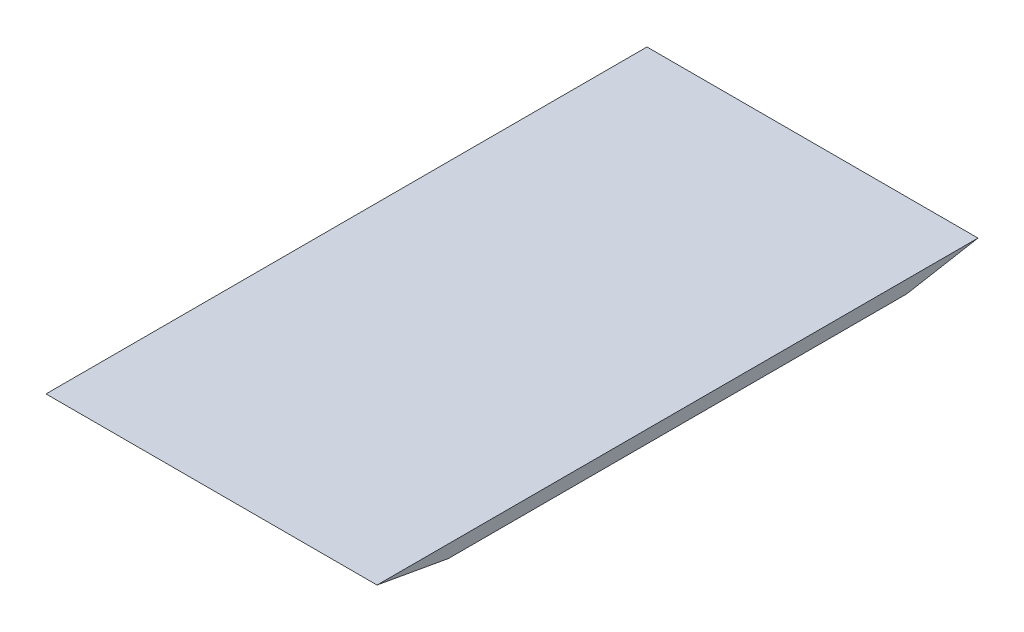
ISO-10303-21;
HEADER;
FILE_DESCRIPTION(('STEP AP214'),'2;1');
FILE_NAME('part.step','',(''),(''),'','','');
FILE_SCHEMA(('AUTOMOTIVE_DESIGN { 1 0 10303 214 1 1 1 1 }'));
ENDSEC;
DATA;
#1=APPLICATION_CONTEXT('core data for automotive mechanical design processes');
#2=APPLICATION_PROTOCOL_DEFINITION('international standard','automotive_design',2000,#1);
#3=PRODUCT_CONTEXT('',#1,'mechanical');
#4=PRODUCT('Part','Part','',(#3));
#5=PRODUCT_RELATED_PRODUCT_CATEGORY('part','',(#4));
#6=PRODUCT_DEFINITION_FORMATION('','',#4);
#7=PRODUCT_DEFINITION_CONTEXT('part definition',#1,'design');
#8=PRODUCT_DEFINITION('design','',#6,#7);
#9=PRODUCT_DEFINITION_SHAPE('','',#8);
#10=(LENGTH_UNIT() NAMED_UNIT(*) SI_UNIT(.MILLI.,.METRE.));
#11=(NAMED_UNIT(*) PLANE_ANGLE_UNIT() SI_UNIT($,.RADIAN.));
#12=(NAMED_UNIT(*) SI_UNIT($,.STERADIAN.) SOLID_ANGLE_UNIT());
#13=UNCERTAINTY_MEASURE_WITH_UNIT(LENGTH_MEASURE(1.E-05),#10,'distance_accuracy_value','');
#14=(GEOMETRIC_REPRESENTATION_CONTEXT(3) GLOBAL_UNCERTAINTY_ASSIGNED_CONTEXT((#13)) GLOBAL_UNIT_ASSIGNED_CONTEXT((#10,
#11,#12)) REPRESENTATION_CONTEXT('',''));
#15=CARTESIAN_POINT('',(0.,0.,0.));
#16=DIRECTION('',(0.,0.,1.));
#17=DIRECTION('',(1.,0.,0.));
#18=AXIS2_PLACEMENT_3D('',#15,#16,#17);
#19=CARTESIAN_POINT('',(130.,-5.00000000000001,-28.));
#20=DIRECTION('',(0.,0.984427575508482,-0.175790638483658));
#21=DIRECTION('',(0.,0.175790638483658,0.984427575508482));
#22=AXIS2_PLACEMENT_3D('',#19,#20,#21);
#23=PLANE('',#22);
#24=DIRECTION('',(0.,-0.175790638483658,-0.984427575508482));
#25=VECTOR('',#24,1.);
#26=CARTESIAN_POINT('',(0.,-5.00000000000001,-28.));
#27=LINE('',#26,#25);
#28=CARTESIAN_POINT('',(0.,0.,0.));
#29=VERTEX_POINT('',#28);
#30=CARTESIAN_POINT('',(0.,-5.00000000000001,-28.));
#31=VERTEX_POINT('',#30);
#32=EDGE_CURVE('E107',#29,#31,#27,.T.);
#33=ORIENTED_EDGE('',*,*,#32,.T.);
#34=DIRECTION('',(-1.,0.,0.));
#35=VECTOR('',#34,1.);
#36=CARTESIAN_POINT('',(130.,-5.00000000000001,-28.));
#37=LINE('',#36,#35);
#38=CARTESIAN_POINT('',(130.,-5.00000000000001,-28.));
#39=VERTEX_POINT('',#38);
#40=EDGE_CURVE('E11',#39,#31,#37,.T.);
#41=ORIENTED_EDGE('',*,*,#40,.F.);
#42=DIRECTION('',(0.,-0.175790638483658,-0.984427575508482));
#43=VECTOR('',#42,1.);
#44=CARTESIAN_POINT('',(130.,-5.00000000000001,-28.));
#45=LINE('',#44,#43);
#46=CARTESIAN_POINT('',(130.,0.,0.));
#47=VERTEX_POINT('',#46);
#48=EDGE_CURVE('E91',#47,#39,#45,.T.);
#49=ORIENTED_EDGE('',*,*,#48,.F.);
#50=DIRECTION('',(-1.,0.,0.));
#51=VECTOR('',#50,1.);
#52=CARTESIAN_POINT('',(130.,0.,0.));
#53=LINE('',#52,#51);
#54=EDGE_CURVE('E103',#47,#29,#53,.T.);
#55=ORIENTED_EDGE('',*,*,#54,.T.);
#56=EDGE_LOOP('',(#33,#41,#49,#55));
#57=FACE_BOUND('',#56,.T.);
#58=ADVANCED_FACE('F39',(#57),#23,.F.);
#59=CARTESIAN_POINT('',(130.,-4.99999999999998,-208.));
#60=DIRECTION('',(0.,1.,0.));
#61=DIRECTION('',(0.,0.,1.));
#62=AXIS2_PLACEMENT_3D('',#59,#60,#61);
#63=PLANE('',#62);
#64=DIRECTION('',(0.,0.,-1.));
#65=VECTOR('',#64,1.);
#66=CARTESIAN_POINT('',(0.,-4.99999999999998,-208.));
#67=LINE('',#66,#65);
#68=CARTESIAN_POINT('',(0.,-4.99999999999998,-208.));
#69=VERTEX_POINT('',#68);
#70=EDGE_CURVE('E96',#31,#69,#67,.T.);
#71=ORIENTED_EDGE('',*,*,#70,.T.);
#72=DIRECTION('',(-1.,0.,0.));
#73=VECTOR('',#72,1.);
#74=CARTESIAN_POINT('',(130.,-4.99999999999998,-208.));
#75=LINE('',#74,#73);
#76=CARTESIAN_POINT('',(130.,-4.99999999999998,-208.));
#77=VERTEX_POINT('',#76);
#78=EDGE_CURVE('E48',#77,#69,#75,.T.);
#79=ORIENTED_EDGE('',*,*,#78,.F.);
#80=DIRECTION('',(0.,0.,-1.));
#81=VECTOR('',#80,1.);
#82=CARTESIAN_POINT('',(130.,-4.99999999999998,-208.));
#83=LINE('',#82,#81);
#84=EDGE_CURVE('E86',#39,#77,#83,.T.);
#85=ORIENTED_EDGE('',*,*,#84,.F.);
#86=ORIENTED_EDGE('',*,*,#40,.T.);
#87=EDGE_LOOP('',(#71,#79,#85,#86));
#88=FACE_BOUND('',#87,.T.);
#89=ADVANCED_FACE('F95',(#88),#63,.F.);
#90=CARTESIAN_POINT('',(130.,0.,-236.));
#91=DIRECTION('',(0.,0.984427575508482,0.175790638483659));
#92=DIRECTION('',(0.,-0.175790638483659,0.984427575508482));
#93=AXIS2_PLACEMENT_3D('',#90,#91,#92);
#94=PLANE('',#93);
#95=DIRECTION('',(0.,0.175790638483659,-0.984427575508482));
#96=VECTOR('',#95,1.);
#97=CARTESIAN_POINT('',(0.,0.,-236.));
#98=LINE('',#97,#96);
#99=CARTESIAN_POINT('',(0.,0.,-236.));
#100=VERTEX_POINT('',#99);
#101=EDGE_CURVE('E73',#69,#100,#98,.T.);
#102=ORIENTED_EDGE('',*,*,#101,.T.);
#103=DIRECTION('',(-1.,0.,0.));
#104=VECTOR('',#103,1.);
#105=CARTESIAN_POINT('',(130.,0.,-236.));
#106=LINE('',#105,#104);
#107=CARTESIAN_POINT('',(130.,0.,-236.));
#108=VERTEX_POINT('',#107);
#109=EDGE_CURVE('E98',#108,#100,#106,.T.);
#110=ORIENTED_EDGE('',*,*,#109,.F.);
#111=DIRECTION('',(0.,0.175790638483659,-0.984427575508482));
#112=VECTOR('',#111,1.);
#113=CARTESIAN_POINT('',(130.,0.,-236.));
#114=LINE('',#113,#112);
#115=EDGE_CURVE('E89',#77,#108,#114,.T.);
#116=ORIENTED_EDGE('',*,*,#115,.F.);
#117=ORIENTED_EDGE('',*,*,#78,.T.);
#118=EDGE_LOOP('',(#102,#110,#116,#117));
#119=FACE_BOUND('',#118,.T.);
#120=ADVANCED_FACE('F99',(#119),#94,.F.);
#121=CARTESIAN_POINT('',(130.,0.,0.));
#122=DIRECTION('',(0.,-1.,0.));
#123=DIRECTION('',(0.,0.,-1.));
#124=AXIS2_PLACEMENT_3D('',#121,#122,#123);
#125=PLANE('',#124);
#126=DIRECTION('',(0.,0.,1.));
#127=VECTOR('',#126,1.);
#128=CARTESIAN_POINT('',(0.,0.,0.));
#129=LINE('',#128,#127);
#130=EDGE_CURVE('E79',#100,#29,#129,.T.);
#131=ORIENTED_EDGE('',*,*,#130,.T.);
#132=ORIENTED_EDGE('',*,*,#54,.F.);
#133=DIRECTION('',(0.,0.,1.));
#134=VECTOR('',#133,1.);
#135=CARTESIAN_POINT('',(130.,0.,0.));
#136=LINE('',#135,#134);
#137=EDGE_CURVE('E56',#108,#47,#136,.T.);
#138=ORIENTED_EDGE('',*,*,#137,.F.);
#139=ORIENTED_EDGE('',*,*,#109,.T.);
#140=EDGE_LOOP('',(#131,#132,#138,#139));
#141=FACE_BOUND('',#140,.T.);
#142=ADVANCED_FACE('F120',(#141),#125,.F.);
#143=CARTESIAN_POINT('',(130.,0.,0.));
#144=DIRECTION('',(1.,0.,0.));
#145=DIRECTION('',(0.,0.,-1.));
#146=AXIS2_PLACEMENT_3D('',#143,#144,#145);
#147=PLANE('',#146);
#148=ORIENTED_EDGE('',*,*,#48,.T.);
#149=ORIENTED_EDGE('',*,*,#84,.T.);
#150=ORIENTED_EDGE('',*,*,#115,.T.);
#151=ORIENTED_EDGE('',*,*,#137,.T.);
#152=EDGE_LOOP('',(#148,#149,#150,#151));
#153=FACE_BOUND('',#152,.T.);
#154=ADVANCED_FACE('F87',(#153),#147,.T.);
#155=CARTESIAN_POINT('',(0.,0.,0.));
#156=DIRECTION('',(1.,0.,0.));
#157=DIRECTION('',(0.,0.,-1.));
#158=AXIS2_PLACEMENT_3D('',#155,#156,#157);
#159=PLANE('',#158);
#160=ORIENTED_EDGE('',*,*,#32,.F.);
#161=ORIENTED_EDGE('',*,*,#130,.F.);
#162=ORIENTED_EDGE('',*,*,#101,.F.);
#163=ORIENTED_EDGE('',*,*,#70,.F.);
#164=EDGE_LOOP('',(#160,#161,#162,#163));
#165=FACE_BOUND('',#164,.T.);
#166=ADVANCED_FACE('F123',(#165),#159,.F.);
#167=CLOSED_SHELL('',(#58,#89,#120,#142,#154,#166));
#168=MANIFOLD_SOLID_BREP('B2',#167);
#169=ADVANCED_BREP_SHAPE_REPRESENTATION('',(#18,#168),#14);
#170=SHAPE_DEFINITION_REPRESENTATION(#9,#169);
ENDSEC;
END-ISO-10303-21;
